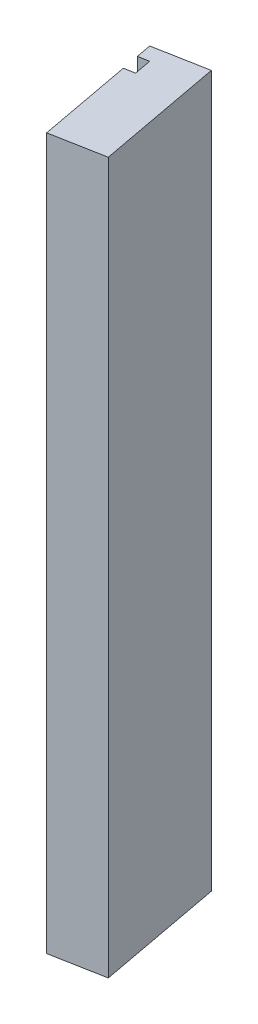
ISO-10303-21;
HEADER;
FILE_DESCRIPTION(('STEP AP214'),'2;1');
FILE_NAME('part.step','',(''),(''),'','','');
FILE_SCHEMA(('AUTOMOTIVE_DESIGN { 1 0 10303 214 1 1 1 1 }'));
ENDSEC;
DATA;
#1=APPLICATION_CONTEXT('core data for automotive mechanical design processes');
#2=APPLICATION_PROTOCOL_DEFINITION('international standard','automotive_design',2000,#1);
#3=PRODUCT_CONTEXT('',#1,'mechanical');
#4=PRODUCT('Part','Part','',(#3));
#5=PRODUCT_RELATED_PRODUCT_CATEGORY('part','',(#4));
#6=PRODUCT_DEFINITION_FORMATION('','',#4);
#7=PRODUCT_DEFINITION_CONTEXT('part definition',#1,'design');
#8=PRODUCT_DEFINITION('design','',#6,#7);
#9=PRODUCT_DEFINITION_SHAPE('','',#8);
#10=(LENGTH_UNIT() NAMED_UNIT(*) SI_UNIT(.MILLI.,.METRE.));
#11=(NAMED_UNIT(*) PLANE_ANGLE_UNIT() SI_UNIT($,.RADIAN.));
#12=(NAMED_UNIT(*) SI_UNIT($,.STERADIAN.) SOLID_ANGLE_UNIT());
#13=UNCERTAINTY_MEASURE_WITH_UNIT(LENGTH_MEASURE(1.E-05),#10,'distance_accuracy_value','');
#14=(GEOMETRIC_REPRESENTATION_CONTEXT(3) GLOBAL_UNCERTAINTY_ASSIGNED_CONTEXT((#13)) GLOBAL_UNIT_ASSIGNED_CONTEXT((#10,
#11,#12)) REPRESENTATION_CONTEXT('',''));
#15=CARTESIAN_POINT('',(0.,0.,0.));
#16=DIRECTION('',(0.,0.,1.));
#17=DIRECTION('',(1.,0.,0.));
#18=AXIS2_PLACEMENT_3D('',#15,#16,#17);
#19=CARTESIAN_POINT('',(-32.9849572487707,0.,6.15573094248328));
#20=DIRECTION('',(-0.983028102298964,0.,0.183455035609539));
#21=DIRECTION('',(-0.183455035609539,0.,-0.983028102298964));
#22=AXIS2_PLACEMENT_3D('',#19,#20,#21);
#23=PLANE('',#22);
#24=DIRECTION('',(0.,1.,0.));
#25=VECTOR('',#24,1.);
#26=CARTESIAN_POINT('',(-22.1189072784947,-55.7109439533743,64.3805294402504));
#27=LINE('',#26,#25);
#28=CARTESIAN_POINT('',(-22.1189072784947,-70.2342206230719,64.3805294402504));
#29=VERTEX_POINT('',#28);
#30=CARTESIAN_POINT('',(-22.1189072784947,-55.7109439533743,64.3805294402504));
#31=VERTEX_POINT('',#30);
#32=EDGE_CURVE('E350',#29,#31,#27,.T.);
#33=ORIENTED_EDGE('',*,*,#32,.T.);
#34=DIRECTION('',(0.183455035609539,0.,0.983028102298964));
#35=VECTOR('',#34,1.);
#36=CARTESIAN_POINT('',(-22.199163606304,-55.7109439533743,63.9504827786165));
#37=LINE('',#36,#35);
#38=CARTESIAN_POINT('',(-22.199163606304,-55.7109439533743,63.9504827786165));
#39=VERTEX_POINT('',#38);
#40=EDGE_CURVE('E407',#39,#31,#37,.T.);
#41=ORIENTED_EDGE('',*,*,#40,.F.);
#42=DIRECTION('',(0.,1.,0.));
#43=VECTOR('',#42,1.);
#44=CARTESIAN_POINT('',(-22.199163606304,-75.8845738792723,63.9504827786165));
#45=LINE('',#44,#43);
#46=CARTESIAN_POINT('',(-22.199163606304,-75.8845738792723,63.9504827786165));
#47=VERTEX_POINT('',#46);
#48=EDGE_CURVE('E402',#47,#39,#45,.T.);
#49=ORIENTED_EDGE('',*,*,#48,.F.);
#50=DIRECTION('',(-0.183455035609539,0.,-0.983028102298964));
#51=VECTOR('',#50,1.);
#52=CARTESIAN_POINT('',(-21.5279471558369,-75.8845738792723,67.5471386640336));
#53=LINE('',#52,#51);
#54=CARTESIAN_POINT('',(-21.7049188142782,-75.8845738792723,66.5988511832336));
#55=VERTEX_POINT('',#54);
#56=EDGE_CURVE('E403',#55,#47,#53,.T.);
#57=ORIENTED_EDGE('',*,*,#56,.F.);
#58=DIRECTION('',(0.,1.,0.));
#59=VECTOR('',#58,1.);
#60=CARTESIAN_POINT('',(-21.7049188142782,-71.1562807682922,66.5988511832336));
#61=LINE('',#60,#59);
#62=CARTESIAN_POINT('',(-21.7049188142782,-71.1562807682922,66.5988511832336));
#63=VERTEX_POINT('',#62);
#64=EDGE_CURVE('E373',#55,#63,#61,.T.);
#65=ORIENTED_EDGE('',*,*,#64,.T.);
#66=DIRECTION('',(-0.169825322901352,0.378245230076341,-0.909994453623728));
#67=VECTOR('',#66,1.);
#68=CARTESIAN_POINT('',(-22.1189072784947,-70.2342206230719,64.3805294402504));
#69=LINE('',#68,#67);
#70=EDGE_CURVE('E376',#63,#29,#69,.T.);
#71=ORIENTED_EDGE('',*,*,#70,.T.);
#72=EDGE_LOOP('',(#33,#41,#49,#57,#65,#71));
#73=FACE_BOUND('',#72,.T.);
#74=DIRECTION('',(0.,-1.,0.));
#75=VECTOR('',#74,1.);
#76=CARTESIAN_POINT('',(-21.8007164542391,-71.6263536806701,66.0855277309635));
#77=LINE('',#76,#75);
#78=CARTESIAN_POINT('',(-21.8007164542391,-71.6263536806701,66.0855277309635));
#79=VERTEX_POINT('',#78);
#80=CARTESIAN_POINT('',(-21.8007164542391,-75.3266931643423,66.0855277309635));
#81=VERTEX_POINT('',#80);
#82=EDGE_CURVE('E317',#79,#81,#77,.T.);
#83=ORIENTED_EDGE('',*,*,#82,.T.);
#84=DIRECTION('',(-0.183455035609539,0.,-0.983028102298964));
#85=VECTOR('',#84,1.);
#86=CARTESIAN_POINT('',(-21.8007164542391,-75.3266931643423,66.0855277309635));
#87=LINE('',#86,#85);
#88=CARTESIAN_POINT('',(-22.1081937201424,-75.3266931643423,64.4379371254686));
#89=VERTEX_POINT('',#88);
#90=EDGE_CURVE('E320',#81,#89,#87,.T.);
#91=ORIENTED_EDGE('',*,*,#90,.T.);
#92=DIRECTION('',(0.,1.,0.));
#93=VECTOR('',#92,1.);
#94=CARTESIAN_POINT('',(-22.1081937201424,-75.3266931643423,64.4379371254686));
#95=LINE('',#94,#93);
#96=CARTESIAN_POINT('',(-22.1081937201424,-70.929819189626,64.4379371254686));
#97=VERTEX_POINT('',#96);
#98=EDGE_CURVE('E323',#89,#97,#95,.T.);
#99=ORIENTED_EDGE('',*,*,#98,.T.);
#100=DIRECTION('',(0.169408129616689,-0.38376367434726,0.907758959124759));
#101=VECTOR('',#100,1.);
#102=CARTESIAN_POINT('',(-22.1081937201424,-70.929819189626,64.4379371254686));
#103=LINE('',#102,#101);
#104=EDGE_CURVE('E256',#97,#79,#103,.T.);
#105=ORIENTED_EDGE('',*,*,#104,.T.);
#106=EDGE_LOOP('',(#83,#91,#99,#105));
#107=FACE_BOUND('',#106,.T.);
#108=ADVANCED_FACE('F34',(#73,#107),#23,.T.);
#109=CARTESIAN_POINT('',(-21.5279471558369,-75.8845738792723,67.5471386640336));
#110=DIRECTION('',(0.,1.,0.));
#111=DIRECTION('',(0.932688499819005,0.,-0.360682911024868));
#112=AXIS2_PLACEMENT_3D('',#109,#110,#111);
#113=PLANE('',#112);
#114=ORIENTED_EDGE('',*,*,#56,.T.);
#115=DIRECTION('',(0.983028102298964,0.,-0.183455035609539));
#116=VECTOR('',#115,1.);
#117=CARTESIAN_POINT('',(-22.199163606304,-75.8845738792723,63.9504827786165));
#118=LINE('',#117,#116);
#119=CARTESIAN_POINT('',(-20.7246214528555,-75.8845738792723,63.6753002252022));
#120=VERTEX_POINT('',#119);
#121=EDGE_CURVE('E11',#47,#120,#118,.T.);
#122=ORIENTED_EDGE('',*,*,#121,.T.);
#123=DIRECTION('',(-0.183455035609539,0.,-0.983028102298964));
#124=VECTOR('',#123,1.);
#125=CARTESIAN_POINT('',(-20.0534050023885,-75.8845738792723,67.2719561106193));
#126=LINE('',#125,#124);
#127=CARTESIAN_POINT('',(-20.0534050023885,-75.8845738792723,67.2719561106193));
#128=VERTEX_POINT('',#127);
#129=EDGE_CURVE('E383',#128,#120,#126,.T.);
#130=ORIENTED_EDGE('',*,*,#129,.F.);
#131=DIRECTION('',(0.983028102298964,0.,-0.183455035609539));
#132=VECTOR('',#131,1.);
#133=CARTESIAN_POINT('',(-21.5279471558369,-75.8845738792723,67.5471386640336));
#134=LINE('',#133,#132);
#135=CARTESIAN_POINT('',(-21.5279471558369,-75.8845738792723,67.5471386640336));
#136=VERTEX_POINT('',#135);
#137=EDGE_CURVE('E412',#136,#128,#134,.T.);
#138=ORIENTED_EDGE('',*,*,#137,.F.);
#139=CARTESIAN_POINT('',(-21.6131912964734,-75.8845738792723,67.0903652343831));
#140=VERTEX_POINT('',#139);
#141=EDGE_CURVE('E399',#136,#140,#53,.T.);
#142=ORIENTED_EDGE('',*,*,#141,.T.);
#143=DIRECTION('',(-0.983028102298964,0.,0.183455035609539));
#144=VECTOR('',#143,1.);
#145=CARTESIAN_POINT('',(-21.3182828657838,-75.8845738792723,67.0353287237002));
#146=LINE('',#145,#144);
#147=CARTESIAN_POINT('',(-21.3182828657838,-75.8845738792723,67.0353287237002));
#148=VERTEX_POINT('',#147);
#149=EDGE_CURVE('E390',#148,#140,#146,.T.);
#150=ORIENTED_EDGE('',*,*,#149,.F.);
#151=DIRECTION('',(-0.183455035609541,0.,-0.983028102298964));
#152=VECTOR('',#151,1.);
#153=CARTESIAN_POINT('',(-21.4100103835885,-75.8845738792723,66.5438146725507));
#154=LINE('',#153,#152);
#155=CARTESIAN_POINT('',(-21.4100103835885,-75.8845738792723,66.5438146725507));
#156=VERTEX_POINT('',#155);
#157=EDGE_CURVE('E356',#148,#156,#154,.T.);
#158=ORIENTED_EDGE('',*,*,#157,.T.);
#159=DIRECTION('',(-0.983028102298964,0.,0.183455035609539));
#160=VECTOR('',#159,1.);
#161=CARTESIAN_POINT('',(-21.4100103835885,-75.8845738792723,66.5438146725507));
#162=LINE('',#161,#160);
#163=EDGE_CURVE('E388',#156,#55,#162,.T.);
#164=ORIENTED_EDGE('',*,*,#163,.T.);
#165=EDGE_LOOP('',(#114,#122,#130,#138,#142,#150,#158,#164));
#166=FACE_BOUND('',#165,.T.);
#167=ADVANCED_FACE('F36',(#166),#113,.F.);
#168=CARTESIAN_POINT('',(-22.199163606304,-75.8845738792723,63.9504827786165));
#169=DIRECTION('',(0.183455035609539,0.,0.983028102298964));
#170=DIRECTION('',(-0.983028102298964,0.,0.183455035609539));
#171=AXIS2_PLACEMENT_3D('',#168,#169,#170);
#172=PLANE('',#171);
#173=DIRECTION('',(0.,1.,0.));
#174=VECTOR('',#173,1.);
#175=CARTESIAN_POINT('',(-20.7246214528555,-75.8845738792723,63.6753002252022));
#176=LINE('',#175,#174);
#177=CARTESIAN_POINT('',(-20.7246214528555,-55.7109439533743,63.6753002252022));
#178=VERTEX_POINT('',#177);
#179=EDGE_CURVE('E415',#120,#178,#176,.T.);
#180=ORIENTED_EDGE('',*,*,#179,.F.);
#181=ORIENTED_EDGE('',*,*,#121,.F.);
#182=ORIENTED_EDGE('',*,*,#48,.T.);
#183=DIRECTION('',(0.983028102298964,0.,-0.183455035609539));
#184=VECTOR('',#183,1.);
#185=CARTESIAN_POINT('',(-22.199163606304,-55.7109439533743,63.9504827786165));
#186=LINE('',#185,#184);
#187=EDGE_CURVE('E42',#39,#178,#186,.T.);
#188=ORIENTED_EDGE('',*,*,#187,.T.);
#189=EDGE_LOOP('',(#180,#181,#182,#188));
#190=FACE_BOUND('',#189,.T.);
#191=ADVANCED_FACE('F429',(#190),#172,.F.);
#192=CARTESIAN_POINT('',(-22.199163606304,-55.7109439533743,63.9504827786165));
#193=DIRECTION('',(0.,-1.,0.));
#194=DIRECTION('',(-0.932688499819005,0.,0.360682911024868));
#195=AXIS2_PLACEMENT_3D('',#192,#193,#194);
#196=PLANE('',#195);
#197=DIRECTION('',(0.183455035609539,0.,0.983028102298964));
#198=VECTOR('',#197,1.);
#199=CARTESIAN_POINT('',(-21.7322713300002,-55.7109439533743,64.817006980717));
#200=LINE('',#199,#198);
#201=CARTESIAN_POINT('',(-21.823998847805,-55.7109439533743,64.3254929295676));
#202=VERTEX_POINT('',#201);
#203=CARTESIAN_POINT('',(-21.7322713300002,-55.7109439533743,64.817006980717));
#204=VERTEX_POINT('',#203);
#205=EDGE_CURVE('E346',#202,#204,#200,.T.);
#206=ORIENTED_EDGE('',*,*,#205,.T.);
#207=DIRECTION('',(-0.983028102298964,0.,0.183455035609539));
#208=VECTOR('',#207,1.);
#209=CARTESIAN_POINT('',(-21.7322713300002,-55.7109439533743,64.817006980717));
#210=LINE('',#209,#208);
#211=CARTESIAN_POINT('',(-22.0271797606899,-55.7109439533743,64.8720434913999));
#212=VERTEX_POINT('',#211);
#213=EDGE_CURVE('E365',#204,#212,#210,.T.);
#214=ORIENTED_EDGE('',*,*,#213,.T.);
#215=CARTESIAN_POINT('',(-21.5279471558369,-55.7109439533743,67.5471386640336));
#216=VERTEX_POINT('',#215);
#217=EDGE_CURVE('E406',#212,#216,#37,.T.);
#218=ORIENTED_EDGE('',*,*,#217,.T.);
#219=DIRECTION('',(0.983028102298964,0.,-0.183455035609539));
#220=VECTOR('',#219,1.);
#221=CARTESIAN_POINT('',(-21.5279471558369,-55.7109439533743,67.5471386640336));
#222=LINE('',#221,#220);
#223=CARTESIAN_POINT('',(-20.0534050023885,-55.7109439533743,67.2719561106193));
#224=VERTEX_POINT('',#223);
#225=EDGE_CURVE('E425',#216,#224,#222,.T.);
#226=ORIENTED_EDGE('',*,*,#225,.T.);
#227=DIRECTION('',(0.183455035609539,0.,0.983028102298964));
#228=VECTOR('',#227,1.);
#229=CARTESIAN_POINT('',(-20.7246214528555,-55.7109439533743,63.6753002252022));
#230=LINE('',#229,#228);
#231=EDGE_CURVE('E418',#178,#224,#230,.T.);
#232=ORIENTED_EDGE('',*,*,#231,.F.);
#233=ORIENTED_EDGE('',*,*,#187,.F.);
#234=ORIENTED_EDGE('',*,*,#40,.T.);
#235=DIRECTION('',(-0.983028102298964,0.,0.183455035609539));
#236=VECTOR('',#235,1.);
#237=CARTESIAN_POINT('',(-21.823998847805,-55.7109439533743,64.3254929295676));
#238=LINE('',#237,#236);
#239=EDGE_CURVE('E381',#202,#31,#238,.T.);
#240=ORIENTED_EDGE('',*,*,#239,.F.);
#241=EDGE_LOOP('',(#206,#214,#218,#226,#232,#233,#234,#240));
#242=FACE_BOUND('',#241,.T.);
#243=ADVANCED_FACE('F446',(#242),#196,.F.);
#244=CARTESIAN_POINT('',(-21.5279471558369,-55.7109439533743,67.5471386640336));
#245=DIRECTION('',(-0.183455035609539,0.,-0.983028102298964));
#246=DIRECTION('',(0.983028102298964,0.,-0.183455035609539));
#247=AXIS2_PLACEMENT_3D('',#244,#245,#246);
#248=PLANE('',#247);
#249=DIRECTION('',(0.,-1.,0.));
#250=VECTOR('',#249,1.);
#251=CARTESIAN_POINT('',(-20.0534050023885,-55.7109439533743,67.2719561106193));
#252=LINE('',#251,#250);
#253=EDGE_CURVE('E421',#224,#128,#252,.T.);
#254=ORIENTED_EDGE('',*,*,#253,.F.);
#255=ORIENTED_EDGE('',*,*,#225,.F.);
#256=DIRECTION('',(0.,-1.,0.));
#257=VECTOR('',#256,1.);
#258=CARTESIAN_POINT('',(-21.5279471558369,-55.7109439533743,67.5471386640336));
#259=LINE('',#258,#257);
#260=EDGE_CURVE('E410',#216,#136,#259,.T.);
#261=ORIENTED_EDGE('',*,*,#260,.T.);
#262=ORIENTED_EDGE('',*,*,#137,.T.);
#263=EDGE_LOOP('',(#254,#255,#261,#262));
#264=FACE_BOUND('',#263,.T.);
#265=ADVANCED_FACE('F467',(#264),#248,.F.);
#266=DIRECTION('',(-0.169825322901352,0.378245230076339,-0.909994453623729));
#267=VECTOR('',#266,1.);
#268=CARTESIAN_POINT('',(-21.9545241114339,-68.9254349126623,65.2613625677183));
#269=LINE('',#268,#267);
#270=CARTESIAN_POINT('',(-21.6131912964734,-69.6856720016994,67.0903652343831));
#271=VERTEX_POINT('',#270);
#272=CARTESIAN_POINT('',(-21.9545241114339,-68.9254349126623,65.2613625677183));
#273=VERTEX_POINT('',#272);
#274=EDGE_CURVE('E249',#271,#273,#269,.T.);
#275=ORIENTED_EDGE('',*,*,#274,.T.);
#276=DIRECTION('',(0.,1.,0.));
#277=VECTOR('',#276,1.);
#278=CARTESIAN_POINT('',(-21.9545241114339,-68.0382118143031,65.2613625677183));
#279=LINE('',#278,#277);
#280=CARTESIAN_POINT('',(-21.9545241114339,-68.0382118143031,65.2613625677183));
#281=VERTEX_POINT('',#280);
#282=EDGE_CURVE('E234',#273,#281,#279,.T.);
#283=ORIENTED_EDGE('',*,*,#282,.T.);
#284=DIRECTION('',(0.169825322901352,-0.378245230076339,0.909994453623729));
#285=VECTOR('',#284,1.);
#286=CARTESIAN_POINT('',(-21.6131912964734,-68.7984489033402,67.0903652343831));
#287=LINE('',#286,#285);
#288=CARTESIAN_POINT('',(-21.6131912964734,-68.7984489033402,67.0903652343831));
#289=VERTEX_POINT('',#288);
#290=EDGE_CURVE('E244',#281,#289,#287,.T.);
#291=ORIENTED_EDGE('',*,*,#290,.T.);
#292=DIRECTION('',(0.,-1.,0.));
#293=VECTOR('',#292,1.);
#294=CARTESIAN_POINT('',(-21.6131912964734,-69.6856720016994,67.0903652343831));
#295=LINE('',#294,#293);
#296=EDGE_CURVE('E241',#289,#271,#295,.T.);
#297=ORIENTED_EDGE('',*,*,#296,.T.);
#298=EDGE_LOOP('',(#275,#283,#291,#297));
#299=FACE_BOUND('',#298,.T.);
#300=DIRECTION('',(0.,-1.,0.));
#301=VECTOR('',#300,1.);
#302=CARTESIAN_POINT('',(-21.6131912964734,-66.6856720016994,67.0903652343831));
#303=LINE('',#302,#301);
#304=CARTESIAN_POINT('',(-21.6131912964734,-65.7984489033402,67.0903652343831));
#305=VERTEX_POINT('',#304);
#306=CARTESIAN_POINT('',(-21.6131912964734,-66.6856720016994,67.0903652343831));
#307=VERTEX_POINT('',#306);
#308=EDGE_CURVE('E269',#305,#307,#303,.T.);
#309=ORIENTED_EDGE('',*,*,#308,.T.);
#310=DIRECTION('',(-0.169825322901352,0.378245230076339,-0.909994453623729));
#311=VECTOR('',#310,1.);
#312=CARTESIAN_POINT('',(-21.9545241114339,-65.9254349126623,65.2613625677183));
#313=LINE('',#312,#311);
#314=CARTESIAN_POINT('',(-21.9545241114339,-65.9254349126623,65.2613625677183));
#315=VERTEX_POINT('',#314);
#316=EDGE_CURVE('E272',#307,#315,#313,.T.);
#317=ORIENTED_EDGE('',*,*,#316,.T.);
#318=DIRECTION('',(0.,1.,0.));
#319=VECTOR('',#318,1.);
#320=CARTESIAN_POINT('',(-21.9545241114339,-65.0382118143031,65.2613625677183));
#321=LINE('',#320,#319);
#322=CARTESIAN_POINT('',(-21.9545241114339,-65.0382118143031,65.2613625677183));
#323=VERTEX_POINT('',#322);
#324=EDGE_CURVE('E276',#315,#323,#321,.T.);
#325=ORIENTED_EDGE('',*,*,#324,.T.);
#326=DIRECTION('',(0.169825322901352,-0.378245230076339,0.909994453623729));
#327=VECTOR('',#326,1.);
#328=CARTESIAN_POINT('',(-21.6131912964734,-65.7984489033402,67.0903652343831));
#329=LINE('',#328,#327);
#330=EDGE_CURVE('E263',#323,#305,#329,.T.);
#331=ORIENTED_EDGE('',*,*,#330,.T.);
#332=EDGE_LOOP('',(#309,#317,#325,#331));
#333=FACE_BOUND('',#332,.T.);
#334=DIRECTION('',(0.,-1.,0.));
#335=VECTOR('',#334,1.);
#336=CARTESIAN_POINT('',(-21.6131912964734,-63.6856720016994,67.0903652343831));
#337=LINE('',#336,#335);
#338=CARTESIAN_POINT('',(-21.6131912964734,-62.7984489033402,67.0903652343831));
#339=VERTEX_POINT('',#338);
#340=CARTESIAN_POINT('',(-21.6131912964734,-63.6856720016994,67.0903652343831));
#341=VERTEX_POINT('',#340);
#342=EDGE_CURVE('E298',#339,#341,#337,.T.);
#343=ORIENTED_EDGE('',*,*,#342,.T.);
#344=DIRECTION('',(-0.169825322901353,0.378245230076338,-0.909994453623729));
#345=VECTOR('',#344,1.);
#346=CARTESIAN_POINT('',(-21.9545241114339,-62.9254349126623,65.2613625677183));
#347=LINE('',#346,#345);
#348=CARTESIAN_POINT('',(-21.9545241114339,-62.9254349126623,65.2613625677183));
#349=VERTEX_POINT('',#348);
#350=EDGE_CURVE('E301',#341,#349,#347,.T.);
#351=ORIENTED_EDGE('',*,*,#350,.T.);
#352=DIRECTION('',(0.,1.,0.));
#353=VECTOR('',#352,1.);
#354=CARTESIAN_POINT('',(-21.9545241114339,-62.0382118143031,65.2613625677183));
#355=LINE('',#354,#353);
#356=CARTESIAN_POINT('',(-21.9545241114339,-62.0382118143031,65.2613625677183));
#357=VERTEX_POINT('',#356);
#358=EDGE_CURVE('E304',#349,#357,#355,.T.);
#359=ORIENTED_EDGE('',*,*,#358,.T.);
#360=DIRECTION('',(0.169825322901353,-0.378245230076335,0.90999445362373));
#361=VECTOR('',#360,1.);
#362=CARTESIAN_POINT('',(-21.6131912964734,-62.7984489033402,67.0903652343831));
#363=LINE('',#362,#361);
#364=EDGE_CURVE('E291',#357,#339,#363,.T.);
#365=ORIENTED_EDGE('',*,*,#364,.T.);
#366=EDGE_LOOP('',(#343,#351,#359,#365));
#367=FACE_BOUND('',#366,.T.);
#368=DIRECTION('',(0.,-1.,0.));
#369=VECTOR('',#368,1.);
#370=CARTESIAN_POINT('',(-21.6131912964734,-70.820453220586,67.0903652343831));
#371=LINE('',#370,#369);
#372=CARTESIAN_POINT('',(-21.6131912964734,-70.820453220586,67.0903652343831));
#373=VERTEX_POINT('',#372);
#374=EDGE_CURVE('E371',#373,#140,#371,.T.);
#375=ORIENTED_EDGE('',*,*,#374,.T.);
#376=ORIENTED_EDGE('',*,*,#141,.F.);
#377=ORIENTED_EDGE('',*,*,#260,.F.);
#378=ORIENTED_EDGE('',*,*,#217,.F.);
#379=DIRECTION('',(0.,-1.,0.));
#380=VECTOR('',#379,1.);
#381=CARTESIAN_POINT('',(-22.0271797606899,-55.7109439533743,64.8720434913999));
#382=LINE('',#381,#380);
#383=CARTESIAN_POINT('',(-22.0271797606899,-69.8983930753657,64.8720434913999));
#384=VERTEX_POINT('',#383);
#385=EDGE_CURVE('E329',#212,#384,#382,.T.);
#386=ORIENTED_EDGE('',*,*,#385,.T.);
#387=DIRECTION('',(0.169825322901352,-0.37824523007634,0.909994453623728));
#388=VECTOR('',#387,1.);
#389=CARTESIAN_POINT('',(-22.0271797606899,-69.8983930753657,64.8720434913999));
#390=LINE('',#389,#388);
#391=EDGE_CURVE('E368',#384,#373,#390,.T.);
#392=ORIENTED_EDGE('',*,*,#391,.T.);
#393=EDGE_LOOP('',(#375,#376,#377,#378,#386,#392));
#394=FACE_BOUND('',#393,.T.);
#395=ADVANCED_FACE('F464',(#299,#333,#367,#394),#23,.T.);
#396=CARTESIAN_POINT('',(-31.5104150953222,0.,5.88054838906897));
#397=DIRECTION('',(-0.983028102298964,0.,0.183455035609539));
#398=DIRECTION('',(-0.183455035609539,0.,-0.983028102298964));
#399=AXIS2_PLACEMENT_3D('',#396,#397,#398);
#400=PLANE('',#399);
#401=ORIENTED_EDGE('',*,*,#129,.T.);
#402=ORIENTED_EDGE('',*,*,#179,.T.);
#403=ORIENTED_EDGE('',*,*,#231,.T.);
#404=ORIENTED_EDGE('',*,*,#253,.T.);
#405=EDGE_LOOP('',(#401,#402,#403,#404));
#406=FACE_BOUND('',#405,.T.);
#407=ADVANCED_FACE('F434',(#406),#400,.F.);
#408=CARTESIAN_POINT('',(-21.823998847805,-55.7109439533743,64.3254929295676));
#409=DIRECTION('',(-0.183455035609539,0.,-0.983028102298964));
#410=DIRECTION('',(0.983028102298964,0.,-0.183455035609539));
#411=AXIS2_PLACEMENT_3D('',#408,#409,#410);
#412=PLANE('',#411);
#413=ORIENTED_EDGE('',*,*,#32,.F.);
#414=DIRECTION('',(-0.983028102298964,0.,0.183455035609539));
#415=VECTOR('',#414,1.);
#416=CARTESIAN_POINT('',(-21.823998847805,-70.2342206230719,64.3254929295676));
#417=LINE('',#416,#415);
#418=CARTESIAN_POINT('',(-21.823998847805,-70.2342206230719,64.3254929295676));
#419=VERTEX_POINT('',#418);
#420=EDGE_CURVE('E384',#419,#29,#417,.T.);
#421=ORIENTED_EDGE('',*,*,#420,.F.);
#422=DIRECTION('',(0.,1.,0.));
#423=VECTOR('',#422,1.);
#424=CARTESIAN_POINT('',(-21.823998847805,-55.7109439533743,64.3254929295676));
#425=LINE('',#424,#423);
#426=EDGE_CURVE('E363',#419,#202,#425,.T.);
#427=ORIENTED_EDGE('',*,*,#426,.T.);
#428=ORIENTED_EDGE('',*,*,#239,.T.);
#429=EDGE_LOOP('',(#413,#421,#427,#428));
#430=FACE_BOUND('',#429,.T.);
#431=ADVANCED_FACE('F479',(#430),#412,.F.);
#432=CARTESIAN_POINT('',(-21.823998847805,-70.2342206230719,64.3254929295676));
#433=DIRECTION('',(-0.0693909921527936,-0.925705431508585,-0.371825690725581));
#434=DIRECTION('',(-0.334692893638794,0.372724127346013,-0.865481017609193));
#435=AXIS2_PLACEMENT_3D('',#432,#433,#434);
#436=PLANE('',#435);
#437=ORIENTED_EDGE('',*,*,#70,.F.);
#438=DIRECTION('',(-0.983028102298964,0.,0.183455035609539));
#439=VECTOR('',#438,1.);
#440=CARTESIAN_POINT('',(-21.4100103835885,-71.1562807682922,66.5438146725507));
#441=LINE('',#440,#439);
#442=CARTESIAN_POINT('',(-21.4100103835885,-71.1562807682922,66.5438146725507));
#443=VERTEX_POINT('',#442);
#444=EDGE_CURVE('E386',#443,#63,#441,.T.);
#445=ORIENTED_EDGE('',*,*,#444,.F.);
#446=DIRECTION('',(-0.169825322901352,0.378245230076341,-0.909994453623728));
#447=VECTOR('',#446,1.);
#448=CARTESIAN_POINT('',(-21.823998847805,-70.2342206230719,64.3254929295676));
#449=LINE('',#448,#447);
#450=EDGE_CURVE('E361',#443,#419,#449,.T.);
#451=ORIENTED_EDGE('',*,*,#450,.T.);
#452=ORIENTED_EDGE('',*,*,#420,.T.);
#453=EDGE_LOOP('',(#437,#445,#451,#452));
#454=FACE_BOUND('',#453,.T.);
#455=ADVANCED_FACE('F480',(#454),#436,.F.);
#456=CARTESIAN_POINT('',(-21.4100103835885,-71.1562807682922,66.5438146725507));
#457=DIRECTION('',(-0.183455035609539,0.,-0.983028102298964));
#458=DIRECTION('',(0.983028102298964,0.,-0.183455035609539));
#459=AXIS2_PLACEMENT_3D('',#456,#457,#458);
#460=PLANE('',#459);
#461=ORIENTED_EDGE('',*,*,#64,.F.);
#462=ORIENTED_EDGE('',*,*,#163,.F.);
#463=DIRECTION('',(0.,1.,0.));
#464=VECTOR('',#463,1.);
#465=CARTESIAN_POINT('',(-21.4100103835885,-71.1562807682922,66.5438146725507));
#466=LINE('',#465,#464);
#467=EDGE_CURVE('E359',#156,#443,#466,.T.);
#468=ORIENTED_EDGE('',*,*,#467,.T.);
#469=ORIENTED_EDGE('',*,*,#444,.T.);
#470=EDGE_LOOP('',(#461,#462,#468,#469));
#471=FACE_BOUND('',#470,.T.);
#472=ADVANCED_FACE('F476',(#471),#460,.F.);
#473=CARTESIAN_POINT('',(-21.3182828657838,-70.820453220586,67.0353287237002));
#474=DIRECTION('',(0.183455035609539,0.,0.983028102298964));
#475=DIRECTION('',(-0.983028102298964,0.,0.183455035609539));
#476=AXIS2_PLACEMENT_3D('',#473,#474,#475);
#477=PLANE('',#476);
#478=ORIENTED_EDGE('',*,*,#374,.F.);
#479=DIRECTION('',(-0.983028102298964,0.,0.183455035609539));
#480=VECTOR('',#479,1.);
#481=CARTESIAN_POINT('',(-21.3182828657838,-70.820453220586,67.0353287237002));
#482=LINE('',#481,#480);
#483=CARTESIAN_POINT('',(-21.3182828657838,-70.820453220586,67.0353287237002));
#484=VERTEX_POINT('',#483);
#485=EDGE_CURVE('E393',#484,#373,#482,.T.);
#486=ORIENTED_EDGE('',*,*,#485,.F.);
#487=DIRECTION('',(0.,-1.,0.));
#488=VECTOR('',#487,1.);
#489=CARTESIAN_POINT('',(-21.3182828657838,-70.820453220586,67.0353287237002));
#490=LINE('',#489,#488);
#491=EDGE_CURVE('E354',#484,#148,#490,.T.);
#492=ORIENTED_EDGE('',*,*,#491,.T.);
#493=ORIENTED_EDGE('',*,*,#149,.T.);
#494=EDGE_LOOP('',(#478,#486,#492,#493));
#495=FACE_BOUND('',#494,.T.);
#496=ADVANCED_FACE('F472',(#495),#477,.F.);
#497=CARTESIAN_POINT('',(-21.7322713300002,-69.8983930753657,64.8170069807171));
#498=DIRECTION('',(0.0693909921527934,0.925705431508585,0.37182569072558));
#499=DIRECTION('',(0.334692893638794,-0.372724127346012,0.865481017609193));
#500=AXIS2_PLACEMENT_3D('',#497,#498,#499);
#501=PLANE('',#500);
#502=ORIENTED_EDGE('',*,*,#391,.F.);
#503=DIRECTION('',(-0.983028102298964,0.,0.183455035609539));
#504=VECTOR('',#503,1.);
#505=CARTESIAN_POINT('',(-21.7322713300002,-69.8983930753657,64.8170069807171));
#506=LINE('',#505,#504);
#507=CARTESIAN_POINT('',(-21.7322713300002,-69.8983930753657,64.8170069807171));
#508=VERTEX_POINT('',#507);
#509=EDGE_CURVE('E395',#508,#384,#506,.T.);
#510=ORIENTED_EDGE('',*,*,#509,.F.);
#511=DIRECTION('',(0.169825322901352,-0.37824523007634,0.909994453623728));
#512=VECTOR('',#511,1.);
#513=CARTESIAN_POINT('',(-21.7322713300002,-69.8983930753657,64.8170069807171));
#514=LINE('',#513,#512);
#515=EDGE_CURVE('E352',#508,#484,#514,.T.);
#516=ORIENTED_EDGE('',*,*,#515,.T.);
#517=ORIENTED_EDGE('',*,*,#485,.T.);
#518=EDGE_LOOP('',(#502,#510,#516,#517));
#519=FACE_BOUND('',#518,.T.);
#520=ADVANCED_FACE('F568',(#519),#501,.F.);
#521=CARTESIAN_POINT('',(-21.7322713300002,-55.7109439533743,64.817006980717));
#522=DIRECTION('',(0.183455035609539,0.,0.983028102298964));
#523=DIRECTION('',(-0.983028102298964,0.,0.183455035609539));
#524=AXIS2_PLACEMENT_3D('',#521,#522,#523);
#525=PLANE('',#524);
#526=ORIENTED_EDGE('',*,*,#385,.F.);
#527=ORIENTED_EDGE('',*,*,#213,.F.);
#528=DIRECTION('',(0.,-1.,0.));
#529=VECTOR('',#528,1.);
#530=CARTESIAN_POINT('',(-21.7322713300002,-55.7109439533743,64.817006980717));
#531=LINE('',#530,#529);
#532=EDGE_CURVE('E349',#204,#508,#531,.T.);
#533=ORIENTED_EDGE('',*,*,#532,.T.);
#534=ORIENTED_EDGE('',*,*,#509,.T.);
#535=EDGE_LOOP('',(#526,#527,#533,#534));
#536=FACE_BOUND('',#535,.T.);
#537=ADVANCED_FACE('F459',(#536),#525,.F.);
#538=CARTESIAN_POINT('',(-32.6900488180809,0.,6.10069443180042));
#539=DIRECTION('',(0.983028102298964,0.,-0.183455035609539));
#540=DIRECTION('',(0.183455035609539,0.,0.983028102298964));
#541=AXIS2_PLACEMENT_3D('',#538,#539,#540);
#542=PLANE('',#541);
#543=ORIENTED_EDGE('',*,*,#205,.F.);
#544=ORIENTED_EDGE('',*,*,#426,.F.);
#545=ORIENTED_EDGE('',*,*,#450,.F.);
#546=ORIENTED_EDGE('',*,*,#467,.F.);
#547=ORIENTED_EDGE('',*,*,#157,.F.);
#548=ORIENTED_EDGE('',*,*,#491,.F.);
#549=ORIENTED_EDGE('',*,*,#515,.F.);
#550=ORIENTED_EDGE('',*,*,#532,.F.);
#551=EDGE_LOOP('',(#543,#544,#545,#546,#547,#548,#549,#550));
#552=FACE_BOUND('',#551,.T.);
#553=ADVANCED_FACE('F451',(#552),#542,.F.);
#554=CARTESIAN_POINT('',(-22.1081937201424,-70.929819189626,64.4379371254686));
#555=DIRECTION('',(-0.731292067807484,0.568521101998837,0.376823125808227));
#556=DIRECTION('',(0.53230381747333,0.82114486009327,-0.205848887890425));
#557=AXIS2_PLACEMENT_3D('',#554,#555,#556);
#558=PLANE('',#557);
#559=ORIENTED_EDGE('',*,*,#104,.F.);
#560=DIRECTION('',(0.297696200303741,0.763121289130045,-0.573605152000235));
#561=VECTOR('',#560,1.);
#562=CARTESIAN_POINT('',(-22.1081937201424,-70.929819189626,64.4379371254686));
#563=LINE('',#562,#561);
#564=CARTESIAN_POINT('',(-22.3326586295184,-71.5052177027166,64.8704392142759));
#565=VERTEX_POINT('',#564);
#566=EDGE_CURVE('E331',#565,#97,#563,.T.);
#567=ORIENTED_EDGE('',*,*,#566,.F.);
#568=DIRECTION('',(-0.169408129616689,0.38376367434726,-0.907758959124759));
#569=VECTOR('',#568,1.);
#570=CARTESIAN_POINT('',(-22.4301358154053,-71.284400655119,64.3481160589508));
#571=LINE('',#570,#569);
#572=CARTESIAN_POINT('',(-22.1660684062424,-71.8825979166379,65.7630986635219));
#573=VERTEX_POINT('',#572);
#574=EDGE_CURVE('E326',#565,#573,#571,.F.);
#575=ORIENTED_EDGE('',*,*,#574,.T.);
#576=DIRECTION('',(0.663614460832291,0.465434438110173,0.585650605049919));
#577=VECTOR('',#576,1.);
#578=CARTESIAN_POINT('',(-21.8007164542391,-71.6263536806701,66.0855277309635));
#579=LINE('',#578,#577);
#580=EDGE_CURVE('E327',#573,#79,#579,.T.);
#581=ORIENTED_EDGE('',*,*,#580,.T.);
#582=EDGE_LOOP('',(#559,#567,#575,#581));
#583=FACE_BOUND('',#582,.T.);
#584=ADVANCED_FACE('F549',(#583),#558,.T.);
#585=CARTESIAN_POINT('',(-21.8007164542391,-71.6263536806701,66.0855277309635));
#586=DIRECTION('',(-0.661690517829903,0.,0.749777072611583));
#587=DIRECTION('',(-0.749777072611583,0.,-0.661690517829903));
#588=AXIS2_PLACEMENT_3D('',#585,#586,#587);
#589=PLANE('',#588);
#590=ORIENTED_EDGE('',*,*,#82,.F.);
#591=ORIENTED_EDGE('',*,*,#580,.F.);
#592=DIRECTION('',(0.,1.,0.));
#593=VECTOR('',#592,1.);
#594=CARTESIAN_POINT('',(-22.1660684062424,-71.6263536806701,65.7630986635219));
#595=LINE('',#594,#593);
#596=CARTESIAN_POINT('',(-22.1660684062424,-74.9427106746843,65.7630986635219));
#597=VERTEX_POINT('',#596);
#598=EDGE_CURVE('E339',#573,#597,#595,.F.);
#599=ORIENTED_EDGE('',*,*,#598,.T.);
#600=DIRECTION('',(0.588905865684815,-0.6189361771297,0.519719049104507));
#601=VECTOR('',#600,1.);
#602=CARTESIAN_POINT('',(-21.8007164542391,-75.3266931643423,66.0855277309635));
#603=LINE('',#602,#601);
#604=EDGE_CURVE('E330',#597,#81,#603,.T.);
#605=ORIENTED_EDGE('',*,*,#604,.T.);
#606=EDGE_LOOP('',(#590,#591,#599,#605));
#607=FACE_BOUND('',#606,.T.);
#608=ADVANCED_FACE('F552',(#607),#589,.T.);
#609=CARTESIAN_POINT('',(-21.8007164542391,-75.3266931643423,66.0855277309635));
#610=DIRECTION('',(-0.774636715709193,-0.615661475325658,0.144564540863621));
#611=DIRECTION('',(-0.580316384884373,0.78286037177466,0.224415979242954));
#612=AXIS2_PLACEMENT_3D('',#609,#610,#611);
#613=PLANE('',#612);
#614=ORIENTED_EDGE('',*,*,#90,.F.);
#615=ORIENTED_EDGE('',*,*,#604,.F.);
#616=DIRECTION('',(0.183455035609539,0.,0.983028102298964));
#617=VECTOR('',#616,1.);
#618=CARTESIAN_POINT('',(-22.0956248849287,-74.9427106746843,66.1405642416464));
#619=LINE('',#618,#617);
#620=CARTESIAN_POINT('',(-22.3326586295184,-74.9427106746843,64.870439214276));
#621=VERTEX_POINT('',#620);
#622=EDGE_CURVE('E342',#597,#621,#619,.F.);
#623=ORIENTED_EDGE('',*,*,#622,.T.);
#624=DIRECTION('',(0.361811948854093,-0.6189361771297,-0.697144262191461));
#625=VECTOR('',#624,1.);
#626=CARTESIAN_POINT('',(-22.1081937201424,-75.3266931643423,64.4379371254686));
#627=LINE('',#626,#625);
#628=EDGE_CURVE('E333',#621,#89,#627,.T.);
#629=ORIENTED_EDGE('',*,*,#628,.T.);
#630=EDGE_LOOP('',(#614,#615,#623,#629));
#631=FACE_BOUND('',#630,.T.);
#632=ADVANCED_FACE('F556',(#631),#613,.T.);
#633=CARTESIAN_POINT('',(-22.1081937201424,-75.3266931643423,64.4379371254686));
#634=DIRECTION('',(-0.887582913588483,0.,-0.460647990884341));
#635=DIRECTION('',(0.460647990884341,0.,-0.887582913588483));
#636=AXIS2_PLACEMENT_3D('',#633,#634,#635);
#637=PLANE('',#636);
#638=ORIENTED_EDGE('',*,*,#98,.F.);
#639=ORIENTED_EDGE('',*,*,#628,.F.);
#640=DIRECTION('',(0.,-1.,0.));
#641=VECTOR('',#640,1.);
#642=CARTESIAN_POINT('',(-22.3326586295184,-75.3266931643423,64.8704392142759));
#643=LINE('',#642,#641);
#644=EDGE_CURVE('E334',#621,#565,#643,.F.);
#645=ORIENTED_EDGE('',*,*,#644,.T.);
#646=ORIENTED_EDGE('',*,*,#566,.T.);
#647=EDGE_LOOP('',(#638,#639,#645,#646));
#648=FACE_BOUND('',#647,.T.);
#649=ADVANCED_FACE('F547',(#648),#637,.T.);
#650=CARTESIAN_POINT('',(-33.2798656794604,0.,6.21076745316614));
#651=DIRECTION('',(-0.983028102298964,0.,0.183455035609539));
#652=DIRECTION('',(-0.183455035609539,0.,-0.983028102298964));
#653=AXIS2_PLACEMENT_3D('',#650,#651,#652);
#654=PLANE('',#653);
#655=ORIENTED_EDGE('',*,*,#574,.F.);
#656=ORIENTED_EDGE('',*,*,#644,.F.);
#657=ORIENTED_EDGE('',*,*,#622,.F.);
#658=ORIENTED_EDGE('',*,*,#598,.F.);
#659=EDGE_LOOP('',(#655,#656,#657,#658));
#660=FACE_BOUND('',#659,.T.);
#661=ADVANCED_FACE('F544',(#660),#654,.T.);
#662=CARTESIAN_POINT('',(-21.121677245324,-63.6856720016994,66.9986377165783));
#663=DIRECTION('',(0.183455035609539,0.,0.983028102298964));
#664=DIRECTION('',(-0.983028102298964,0.,0.183455035609539));
#665=AXIS2_PLACEMENT_3D('',#662,#663,#664);
#666=PLANE('',#665);
#667=ORIENTED_EDGE('',*,*,#342,.F.);
#668=DIRECTION('',(-0.983028102298964,0.,0.183455035609539));
#669=VECTOR('',#668,1.);
#670=CARTESIAN_POINT('',(-21.121677245324,-62.7984489033402,66.9986377165783));
#671=LINE('',#670,#669);
#672=CARTESIAN_POINT('',(-21.121677245324,-62.7984489033402,66.9986377165783));
#673=VERTEX_POINT('',#672);
#674=EDGE_CURVE('E273',#673,#339,#671,.T.);
#675=ORIENTED_EDGE('',*,*,#674,.F.);
#676=DIRECTION('',(0.,-1.,0.));
#677=VECTOR('',#676,1.);
#678=CARTESIAN_POINT('',(-21.121677245324,-63.6856720016994,66.9986377165783));
#679=LINE('',#678,#677);
#680=CARTESIAN_POINT('',(-21.121677245324,-63.6856720016994,66.9986377165783));
#681=VERTEX_POINT('',#680);
#682=EDGE_CURVE('E287',#673,#681,#679,.T.);
#683=ORIENTED_EDGE('',*,*,#682,.T.);
#684=DIRECTION('',(-0.983028102298964,0.,0.183455035609539));
#685=VECTOR('',#684,1.);
#686=CARTESIAN_POINT('',(-21.121677245324,-63.6856720016994,66.9986377165783));
#687=LINE('',#686,#685);
#688=EDGE_CURVE('E297',#681,#341,#687,.T.);
#689=ORIENTED_EDGE('',*,*,#688,.T.);
#690=EDGE_LOOP('',(#667,#675,#683,#689));
#691=FACE_BOUND('',#690,.T.);
#692=ADVANCED_FACE('F510',(#691),#666,.F.);
#693=CARTESIAN_POINT('',(-21.121677245324,-62.7984489033402,66.9986377165783));
#694=DIRECTION('',(0.0693909921527924,0.925705431508588,0.371825690725574));
#695=DIRECTION('',(0.334692893638795,-0.372724127346007,0.865481017609195));
#696=AXIS2_PLACEMENT_3D('',#693,#694,#695);
#697=PLANE('',#696);
#698=ORIENTED_EDGE('',*,*,#364,.F.);
#699=DIRECTION('',(-0.983028102298964,0.,0.183455035609539));
#700=VECTOR('',#699,1.);
#701=CARTESIAN_POINT('',(-21.4630100602844,-62.0382118143031,65.1696350499136));
#702=LINE('',#701,#700);
#703=CARTESIAN_POINT('',(-21.4630100602844,-62.0382118143031,65.1696350499136));
#704=VERTEX_POINT('',#703);
#705=EDGE_CURVE('E310',#704,#357,#702,.T.);
#706=ORIENTED_EDGE('',*,*,#705,.F.);
#707=DIRECTION('',(0.169825322901353,-0.378245230076335,0.90999445362373));
#708=VECTOR('',#707,1.);
#709=CARTESIAN_POINT('',(-21.121677245324,-62.7984489033402,66.9986377165783));
#710=LINE('',#709,#708);
#711=EDGE_CURVE('E295',#704,#673,#710,.T.);
#712=ORIENTED_EDGE('',*,*,#711,.T.);
#713=ORIENTED_EDGE('',*,*,#674,.T.);
#714=EDGE_LOOP('',(#698,#706,#712,#713));
#715=FACE_BOUND('',#714,.T.);
#716=ADVANCED_FACE('F523',(#715),#697,.F.);
#717=CARTESIAN_POINT('',(-21.4630100602844,-62.0382118143031,65.1696350499136));
#718=DIRECTION('',(-0.183455035609539,0.,-0.983028102298964));
#719=DIRECTION('',(0.983028102298964,0.,-0.183455035609539));
#720=AXIS2_PLACEMENT_3D('',#717,#718,#719);
#721=PLANE('',#720);
#722=ORIENTED_EDGE('',*,*,#358,.F.);
#723=DIRECTION('',(-0.983028102298964,0.,0.183455035609539));
#724=VECTOR('',#723,1.);
#725=CARTESIAN_POINT('',(-21.4630100602844,-62.9254349126623,65.1696350499136));
#726=LINE('',#725,#724);
#727=CARTESIAN_POINT('',(-21.4630100602844,-62.9254349126623,65.1696350499136));
#728=VERTEX_POINT('',#727);
#729=EDGE_CURVE('E312',#728,#349,#726,.T.);
#730=ORIENTED_EDGE('',*,*,#729,.F.);
#731=DIRECTION('',(0.,1.,0.));
#732=VECTOR('',#731,1.);
#733=CARTESIAN_POINT('',(-21.4630100602844,-62.0382118143031,65.1696350499136));
#734=LINE('',#733,#732);
#735=EDGE_CURVE('E293',#728,#704,#734,.T.);
#736=ORIENTED_EDGE('',*,*,#735,.T.);
#737=ORIENTED_EDGE('',*,*,#705,.T.);
#738=EDGE_LOOP('',(#722,#730,#736,#737));
#739=FACE_BOUND('',#738,.T.);
#740=ADVANCED_FACE('F519',(#739),#721,.F.);
#741=CARTESIAN_POINT('',(-21.4630100602844,-62.9254349126623,65.1696350499136));
#742=DIRECTION('',(-0.069390992152793,-0.925705431508587,-0.371825690725577));
#743=DIRECTION('',(-0.334692893638795,0.37272412734601,-0.865481017609194));
#744=AXIS2_PLACEMENT_3D('',#741,#742,#743);
#745=PLANE('',#744);
#746=ORIENTED_EDGE('',*,*,#350,.F.);
#747=ORIENTED_EDGE('',*,*,#688,.F.);
#748=DIRECTION('',(-0.169825322901353,0.378245230076338,-0.909994453623729));
#749=VECTOR('',#748,1.);
#750=CARTESIAN_POINT('',(-21.4630100602844,-62.9254349126623,65.1696350499136));
#751=LINE('',#750,#749);
#752=EDGE_CURVE('E290',#681,#728,#751,.T.);
#753=ORIENTED_EDGE('',*,*,#752,.T.);
#754=ORIENTED_EDGE('',*,*,#729,.T.);
#755=EDGE_LOOP('',(#746,#747,#753,#754));
#756=FACE_BOUND('',#755,.T.);
#757=ADVANCED_FACE('F514',(#756),#745,.F.);
#758=CARTESIAN_POINT('',(-32.4934431976213,0.,6.06400342467851));
#759=DIRECTION('',(0.983028102298964,0.,-0.18345503560954));
#760=DIRECTION('',(0.18345503560954,0.,0.983028102298964));
#761=AXIS2_PLACEMENT_3D('',#758,#759,#760);
#762=PLANE('',#761);
#763=ORIENTED_EDGE('',*,*,#682,.F.);
#764=ORIENTED_EDGE('',*,*,#711,.F.);
#765=ORIENTED_EDGE('',*,*,#735,.F.);
#766=ORIENTED_EDGE('',*,*,#752,.F.);
#767=EDGE_LOOP('',(#763,#764,#765,#766));
#768=FACE_BOUND('',#767,.T.);
#769=ADVANCED_FACE('F525',(#768),#762,.F.);
#770=CARTESIAN_POINT('',(-21.121677245324,-66.6856720016994,66.9986377165783));
#771=DIRECTION('',(0.183455035609539,0.,0.983028102298964));
#772=DIRECTION('',(-0.983028102298964,0.,0.183455035609539));
#773=AXIS2_PLACEMENT_3D('',#770,#771,#772);
#774=PLANE('',#773);
#775=ORIENTED_EDGE('',*,*,#308,.F.);
#776=DIRECTION('',(-0.983028102298964,0.,0.183455035609539));
#777=VECTOR('',#776,1.);
#778=CARTESIAN_POINT('',(-21.121677245324,-65.7984489033402,66.9986377165783));
#779=LINE('',#778,#777);
#780=CARTESIAN_POINT('',(-21.121677245324,-65.7984489033402,66.9986377165783));
#781=VERTEX_POINT('',#780);
#782=EDGE_CURVE('E251',#781,#305,#779,.T.);
#783=ORIENTED_EDGE('',*,*,#782,.F.);
#784=DIRECTION('',(0.,-1.,0.));
#785=VECTOR('',#784,1.);
#786=CARTESIAN_POINT('',(-21.121677245324,-66.6856720016994,66.9986377165783));
#787=LINE('',#786,#785);
#788=CARTESIAN_POINT('',(-21.121677245324,-66.6856720016994,66.9986377165783));
#789=VERTEX_POINT('',#788);
#790=EDGE_CURVE('E260',#781,#789,#787,.T.);
#791=ORIENTED_EDGE('',*,*,#790,.T.);
#792=DIRECTION('',(-0.983028102298964,0.,0.183455035609539));
#793=VECTOR('',#792,1.);
#794=CARTESIAN_POINT('',(-21.121677245324,-66.6856720016994,66.9986377165783));
#795=LINE('',#794,#793);
#796=EDGE_CURVE('E57',#789,#307,#795,.T.);
#797=ORIENTED_EDGE('',*,*,#796,.T.);
#798=EDGE_LOOP('',(#775,#783,#791,#797));
#799=FACE_BOUND('',#798,.T.);
#800=ADVANCED_FACE('F527',(#799),#774,.F.);
#801=CARTESIAN_POINT('',(-21.121677245324,-65.7984489033402,66.9986377165783));
#802=DIRECTION('',(0.0693909921527932,0.925705431508586,0.371825690725578));
#803=DIRECTION('',(0.334692893638795,-0.372724127346011,0.865481017609194));
#804=AXIS2_PLACEMENT_3D('',#801,#802,#803);
#805=PLANE('',#804);
#806=ORIENTED_EDGE('',*,*,#330,.F.);
#807=DIRECTION('',(-0.983028102298964,0.,0.183455035609539));
#808=VECTOR('',#807,1.);
#809=CARTESIAN_POINT('',(-21.4630100602844,-65.0382118143031,65.1696350499136));
#810=LINE('',#809,#808);
#811=CARTESIAN_POINT('',(-21.4630100602844,-65.0382118143031,65.1696350499136));
#812=VERTEX_POINT('',#811);
#813=EDGE_CURVE('E282',#812,#323,#810,.T.);
#814=ORIENTED_EDGE('',*,*,#813,.F.);
#815=DIRECTION('',(0.169825322901352,-0.378245230076339,0.909994453623729));
#816=VECTOR('',#815,1.);
#817=CARTESIAN_POINT('',(-21.121677245324,-65.7984489033402,66.9986377165783));
#818=LINE('',#817,#816);
#819=EDGE_CURVE('E267',#812,#781,#818,.T.);
#820=ORIENTED_EDGE('',*,*,#819,.T.);
#821=ORIENTED_EDGE('',*,*,#782,.T.);
#822=EDGE_LOOP('',(#806,#814,#820,#821));
#823=FACE_BOUND('',#822,.T.);
#824=ADVANCED_FACE('F533',(#823),#805,.F.);
#825=CARTESIAN_POINT('',(-21.4630100602844,-65.0382118143031,65.1696350499136));
#826=DIRECTION('',(-0.183455035609539,0.,-0.983028102298964));
#827=DIRECTION('',(0.983028102298964,0.,-0.183455035609539));
#828=AXIS2_PLACEMENT_3D('',#825,#826,#827);
#829=PLANE('',#828);
#830=ORIENTED_EDGE('',*,*,#324,.F.);
#831=DIRECTION('',(-0.983028102298964,0.,0.183455035609539));
#832=VECTOR('',#831,1.);
#833=CARTESIAN_POINT('',(-21.4630100602844,-65.9254349126623,65.1696350499136));
#834=LINE('',#833,#832);
#835=CARTESIAN_POINT('',(-21.4630100602844,-65.9254349126623,65.1696350499136));
#836=VERTEX_POINT('',#835);
#837=EDGE_CURVE('E284',#836,#315,#834,.T.);
#838=ORIENTED_EDGE('',*,*,#837,.F.);
#839=DIRECTION('',(0.,1.,0.));
#840=VECTOR('',#839,1.);
#841=CARTESIAN_POINT('',(-21.4630100602844,-65.0382118143031,65.1696350499136));
#842=LINE('',#841,#840);
#843=EDGE_CURVE('E265',#836,#812,#842,.T.);
#844=ORIENTED_EDGE('',*,*,#843,.T.);
#845=ORIENTED_EDGE('',*,*,#813,.T.);
#846=EDGE_LOOP('',(#830,#838,#844,#845));
#847=FACE_BOUND('',#846,.T.);
#848=ADVANCED_FACE('F667',(#847),#829,.F.);
#849=CARTESIAN_POINT('',(-21.4630100602844,-65.9254349126623,65.1696350499136));
#850=DIRECTION('',(-0.0693909921527932,-0.925705431508586,-0.371825690725578));
#851=DIRECTION('',(-0.334692893638795,0.372724127346011,-0.865481017609194));
#852=AXIS2_PLACEMENT_3D('',#849,#850,#851);
#853=PLANE('',#852);
#854=ORIENTED_EDGE('',*,*,#316,.F.);
#855=ORIENTED_EDGE('',*,*,#796,.F.);
#856=DIRECTION('',(-0.169825322901352,0.378245230076339,-0.909994453623729));
#857=VECTOR('',#856,1.);
#858=CARTESIAN_POINT('',(-21.4630100602844,-65.9254349126623,65.1696350499136));
#859=LINE('',#858,#857);
#860=EDGE_CURVE('E262',#789,#836,#859,.T.);
#861=ORIENTED_EDGE('',*,*,#860,.T.);
#862=ORIENTED_EDGE('',*,*,#837,.T.);
#863=EDGE_LOOP('',(#854,#855,#861,#862));
#864=FACE_BOUND('',#863,.T.);
#865=ADVANCED_FACE('F677',(#864),#853,.F.);
#866=CARTESIAN_POINT('',(-32.4934431976212,0.,6.06400342467851));
#867=DIRECTION('',(0.983028102298964,0.,-0.18345503560954));
#868=DIRECTION('',(0.18345503560954,0.,0.983028102298964));
#869=AXIS2_PLACEMENT_3D('',#866,#867,#868);
#870=PLANE('',#869);
#871=ORIENTED_EDGE('',*,*,#790,.F.);
#872=ORIENTED_EDGE('',*,*,#819,.F.);
#873=ORIENTED_EDGE('',*,*,#843,.F.);
#874=ORIENTED_EDGE('',*,*,#860,.F.);
#875=EDGE_LOOP('',(#871,#872,#873,#874));
#876=FACE_BOUND('',#875,.T.);
#877=ADVANCED_FACE('F687',(#876),#870,.F.);
#878=CARTESIAN_POINT('',(-21.4630100602844,-68.9254349126623,65.1696350499136));
#879=DIRECTION('',(-0.0693909921527932,-0.925705431508586,-0.371825690725578));
#880=DIRECTION('',(-0.334692893638795,0.372724127346011,-0.865481017609194));
#881=AXIS2_PLACEMENT_3D('',#878,#879,#880);
#882=PLANE('',#881);
#883=ORIENTED_EDGE('',*,*,#274,.F.);
#884=DIRECTION('',(-0.983028102298964,0.,0.183455035609539));
#885=VECTOR('',#884,1.);
#886=CARTESIAN_POINT('',(-21.121677245324,-69.6856720016994,66.9986377165783));
#887=LINE('',#886,#885);
#888=CARTESIAN_POINT('',(-21.121677245324,-69.6856720016994,66.9986377165783));
#889=VERTEX_POINT('',#888);
#890=EDGE_CURVE('E240',#889,#271,#887,.T.);
#891=ORIENTED_EDGE('',*,*,#890,.F.);
#892=DIRECTION('',(-0.169825322901352,0.378245230076339,-0.909994453623729));
#893=VECTOR('',#892,1.);
#894=CARTESIAN_POINT('',(-21.4630100602844,-68.9254349126623,65.1696350499136));
#895=LINE('',#894,#893);
#896=CARTESIAN_POINT('',(-21.4630100602844,-68.9254349126623,65.1696350499136));
#897=VERTEX_POINT('',#896);
#898=EDGE_CURVE('E226',#889,#897,#895,.T.);
#899=ORIENTED_EDGE('',*,*,#898,.T.);
#900=DIRECTION('',(-0.983028102298964,0.,0.183455035609539));
#901=VECTOR('',#900,1.);
#902=CARTESIAN_POINT('',(-21.4630100602844,-68.9254349126623,65.1696350499136));
#903=LINE('',#902,#901);
#904=EDGE_CURVE('E49',#897,#273,#903,.T.);
#905=ORIENTED_EDGE('',*,*,#904,.T.);
#906=EDGE_LOOP('',(#883,#891,#899,#905));
#907=FACE_BOUND('',#906,.T.);
#908=ADVANCED_FACE('F239',(#907),#882,.F.);
#909=CARTESIAN_POINT('',(-21.121677245324,-69.6856720016994,66.9986377165783));
#910=DIRECTION('',(0.183455035609539,0.,0.983028102298964));
#911=DIRECTION('',(-0.983028102298964,0.,0.183455035609539));
#912=AXIS2_PLACEMENT_3D('',#909,#910,#911);
#913=PLANE('',#912);
#914=ORIENTED_EDGE('',*,*,#296,.F.);
#915=DIRECTION('',(-0.983028102298964,0.,0.183455035609539));
#916=VECTOR('',#915,1.);
#917=CARTESIAN_POINT('',(-21.121677245324,-68.7984489033402,66.9986377165783));
#918=LINE('',#917,#916);
#919=CARTESIAN_POINT('',(-21.121677245324,-68.7984489033402,66.9986377165783));
#920=VERTEX_POINT('',#919);
#921=EDGE_CURVE('E257',#920,#289,#918,.T.);
#922=ORIENTED_EDGE('',*,*,#921,.F.);
#923=DIRECTION('',(0.,-1.,0.));
#924=VECTOR('',#923,1.);
#925=CARTESIAN_POINT('',(-21.121677245324,-69.6856720016994,66.9986377165783));
#926=LINE('',#925,#924);
#927=EDGE_CURVE('E237',#920,#889,#926,.T.);
#928=ORIENTED_EDGE('',*,*,#927,.T.);
#929=ORIENTED_EDGE('',*,*,#890,.T.);
#930=EDGE_LOOP('',(#914,#922,#928,#929));
#931=FACE_BOUND('',#930,.T.);
#932=ADVANCED_FACE('F705',(#931),#913,.F.);
#933=CARTESIAN_POINT('',(-21.121677245324,-68.7984489033402,66.9986377165783));
#934=DIRECTION('',(0.0693909921527932,0.925705431508586,0.371825690725578));
#935=DIRECTION('',(0.334692893638795,-0.372724127346011,0.865481017609194));
#936=AXIS2_PLACEMENT_3D('',#933,#934,#935);
#937=PLANE('',#936);
#938=ORIENTED_EDGE('',*,*,#290,.F.);
#939=DIRECTION('',(-0.983028102298964,0.,0.183455035609539));
#940=VECTOR('',#939,1.);
#941=CARTESIAN_POINT('',(-21.4630100602844,-68.0382118143031,65.1696350499136));
#942=LINE('',#941,#940);
#943=CARTESIAN_POINT('',(-21.4630100602844,-68.0382118143031,65.1696350499136));
#944=VERTEX_POINT('',#943);
#945=EDGE_CURVE('E236',#944,#281,#942,.T.);
#946=ORIENTED_EDGE('',*,*,#945,.F.);
#947=DIRECTION('',(0.169825322901352,-0.378245230076339,0.909994453623729));
#948=VECTOR('',#947,1.);
#949=CARTESIAN_POINT('',(-21.121677245324,-68.7984489033402,66.9986377165783));
#950=LINE('',#949,#948);
#951=EDGE_CURVE('E228',#944,#920,#950,.T.);
#952=ORIENTED_EDGE('',*,*,#951,.T.);
#953=ORIENTED_EDGE('',*,*,#921,.T.);
#954=EDGE_LOOP('',(#938,#946,#952,#953));
#955=FACE_BOUND('',#954,.T.);
#956=ADVANCED_FACE('F714',(#955),#937,.F.);
#957=CARTESIAN_POINT('',(-21.4630100602844,-68.0382118143031,65.1696350499136));
#958=DIRECTION('',(-0.183455035609539,0.,-0.983028102298964));
#959=DIRECTION('',(0.983028102298964,0.,-0.183455035609539));
#960=AXIS2_PLACEMENT_3D('',#957,#958,#959);
#961=PLANE('',#960);
#962=ORIENTED_EDGE('',*,*,#282,.F.);
#963=ORIENTED_EDGE('',*,*,#904,.F.);
#964=DIRECTION('',(0.,1.,0.));
#965=VECTOR('',#964,1.);
#966=CARTESIAN_POINT('',(-21.4630100602844,-68.0382118143031,65.1696350499136));
#967=LINE('',#966,#965);
#968=EDGE_CURVE('E223',#897,#944,#967,.T.);
#969=ORIENTED_EDGE('',*,*,#968,.T.);
#970=ORIENTED_EDGE('',*,*,#945,.T.);
#971=EDGE_LOOP('',(#962,#963,#969,#970));
#972=FACE_BOUND('',#971,.T.);
#973=ADVANCED_FACE('F232',(#972),#961,.F.);
#974=CARTESIAN_POINT('',(-32.4934431976212,0.,6.06400342467851));
#975=DIRECTION('',(0.983028102298964,0.,-0.18345503560954));
#976=DIRECTION('',(0.18345503560954,0.,0.983028102298964));
#977=AXIS2_PLACEMENT_3D('',#974,#975,#976);
#978=PLANE('',#977);
#979=ORIENTED_EDGE('',*,*,#898,.F.);
#980=ORIENTED_EDGE('',*,*,#927,.F.);
#981=ORIENTED_EDGE('',*,*,#951,.F.);
#982=ORIENTED_EDGE('',*,*,#968,.F.);
#983=EDGE_LOOP('',(#979,#980,#981,#982));
#984=FACE_BOUND('',#983,.T.);
#985=ADVANCED_FACE('F224',(#984),#978,.F.);
#986=CLOSED_SHELL('',(#108,#167,#191,#243,#265,#395,#407,#431,#455,#472,#496,#520,#537,#553,
#584,#608,#632,#649,#661,#692,#716,#740,#757,#769,#800,#824,#848,#865,#877,#908,#932,#956,#973,#985));
#987=MANIFOLD_SOLID_BREP('B2',#986);
#988=ADVANCED_BREP_SHAPE_REPRESENTATION('',(#18,#987),#14);
#989=SHAPE_DEFINITION_REPRESENTATION(#9,#988);
ENDSEC;
END-ISO-10303-21;
